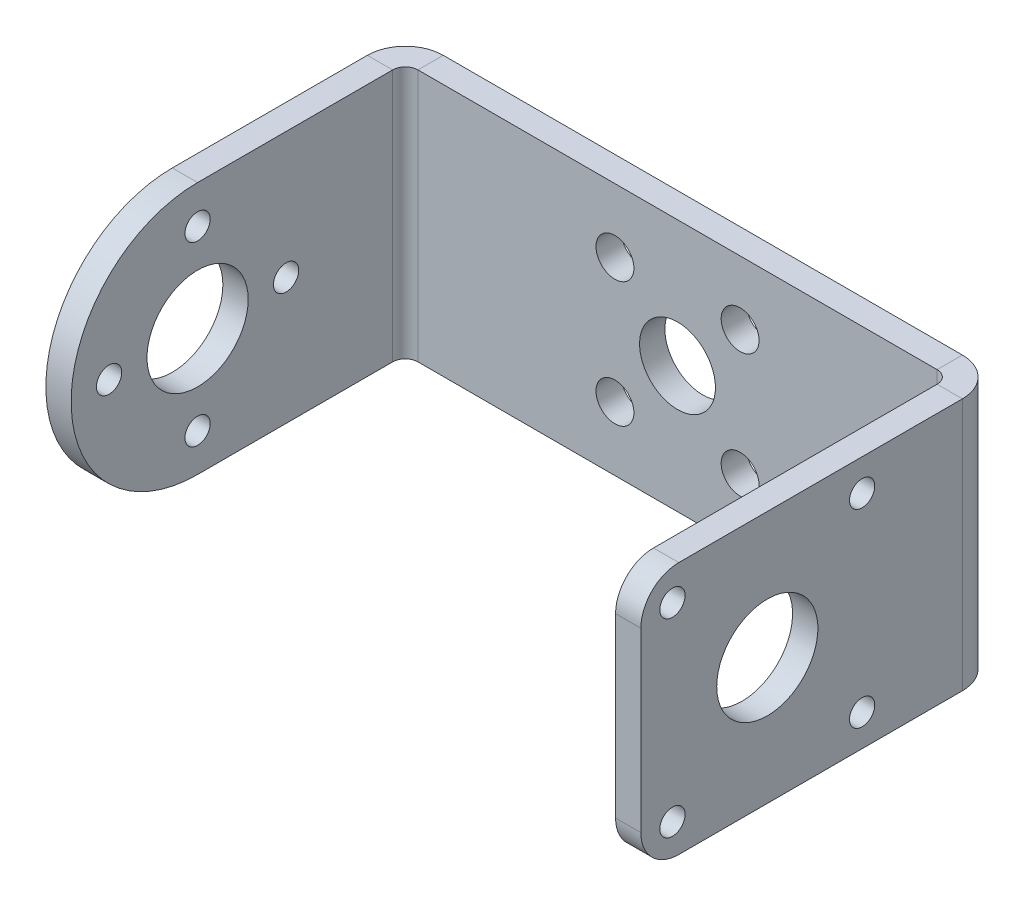
ISO-10303-21;
HEADER;
FILE_DESCRIPTION(('STEP AP214'),'2;1');
FILE_NAME('part.step','',(''),(''),'','','');
FILE_SCHEMA(('AUTOMOTIVE_DESIGN { 1 0 10303 214 1 1 1 1 }'));
ENDSEC;
DATA;
#1=APPLICATION_CONTEXT('core data for automotive mechanical design processes');
#2=APPLICATION_PROTOCOL_DEFINITION('international standard','automotive_design',2000,#1);
#3=PRODUCT_CONTEXT('',#1,'mechanical');
#4=PRODUCT('Part','Part','',(#3));
#5=PRODUCT_RELATED_PRODUCT_CATEGORY('part','',(#4));
#6=PRODUCT_DEFINITION_FORMATION('','',#4);
#7=PRODUCT_DEFINITION_CONTEXT('part definition',#1,'design');
#8=PRODUCT_DEFINITION('design','',#6,#7);
#9=PRODUCT_DEFINITION_SHAPE('','',#8);
#10=(LENGTH_UNIT() NAMED_UNIT(*) SI_UNIT(.MILLI.,.METRE.));
#11=(NAMED_UNIT(*) PLANE_ANGLE_UNIT() SI_UNIT($,.RADIAN.));
#12=(NAMED_UNIT(*) SI_UNIT($,.STERADIAN.) SOLID_ANGLE_UNIT());
#13=UNCERTAINTY_MEASURE_WITH_UNIT(LENGTH_MEASURE(1.E-05),#10,'distance_accuracy_value','');
#14=(GEOMETRIC_REPRESENTATION_CONTEXT(3) GLOBAL_UNCERTAINTY_ASSIGNED_CONTEXT((#13)) GLOBAL_UNIT_ASSIGNED_CONTEXT((#10,
#11,#12)) REPRESENTATION_CONTEXT('',''));
#15=CARTESIAN_POINT('',(0.,0.,0.));
#16=DIRECTION('',(0.,0.,1.));
#17=DIRECTION('',(1.,0.,0.));
#18=AXIS2_PLACEMENT_3D('',#15,#16,#17);
#19=CARTESIAN_POINT('',(10.,0.,-2.));
#20=DIRECTION('',(0.,1.,0.));
#21=DIRECTION('',(0.,0.,1.));
#22=AXIS2_PLACEMENT_3D('',#19,#20,#21);
#23=PLANE('',#22);
#24=DIRECTION('',(-1.,0.,0.));
#25=VECTOR('',#24,1.);
#26=CARTESIAN_POINT('',(10.,0.,0.));
#27=LINE('',#26,#25);
#28=CARTESIAN_POINT('',(69.6292036732051,0.,0.));
#29=VERTEX_POINT('',#28);
#30=CARTESIAN_POINT('',(28.5707963267949,0.,0.));
#31=VERTEX_POINT('',#30);
#32=EDGE_CURVE('E71',#29,#31,#27,.T.);
#33=ORIENTED_EDGE('',*,*,#32,.F.);
#34=DIRECTION('',(0.,0.,-1.));
#35=VECTOR('',#34,1.);
#36=CARTESIAN_POINT('',(69.6292036732051,0.,-2.));
#37=LINE('',#36,#35);
#38=CARTESIAN_POINT('',(69.6292036732051,0.,-2.));
#39=VERTEX_POINT('',#38);
#40=EDGE_CURVE('E315',#29,#39,#37,.T.);
#41=ORIENTED_EDGE('',*,*,#40,.T.);
#42=DIRECTION('',(-1.,0.,0.));
#43=VECTOR('',#42,1.);
#44=CARTESIAN_POINT('',(10.,0.,-2.));
#45=LINE('',#44,#43);
#46=CARTESIAN_POINT('',(28.5707963267949,0.,-2.));
#47=VERTEX_POINT('',#46);
#48=EDGE_CURVE('E50',#39,#47,#45,.T.);
#49=ORIENTED_EDGE('',*,*,#48,.T.);
#50=DIRECTION('',(0.,0.,-1.));
#51=VECTOR('',#50,1.);
#52=CARTESIAN_POINT('',(28.5707963267949,0.,-2.));
#53=LINE('',#52,#51);
#54=EDGE_CURVE('E310',#31,#47,#53,.T.);
#55=ORIENTED_EDGE('',*,*,#54,.F.);
#56=EDGE_LOOP('',(#33,#41,#49,#55));
#57=FACE_BOUND('',#56,.T.);
#58=ADVANCED_FACE('F46',(#57),#23,.T.);
#59=CARTESIAN_POINT('',(95.2,-20.,-2.));
#60=DIRECTION('',(0.,-1.,0.));
#61=DIRECTION('',(0.,0.,-1.));
#62=AXIS2_PLACEMENT_3D('',#59,#60,#61);
#63=PLANE('',#62);
#64=DIRECTION('',(1.,0.,0.));
#65=VECTOR('',#64,1.);
#66=CARTESIAN_POINT('',(95.2,-20.,-2.));
#67=LINE('',#66,#65);
#68=CARTESIAN_POINT('',(28.5707963267949,-20.,-2.));
#69=VERTEX_POINT('',#68);
#70=CARTESIAN_POINT('',(69.6292036732051,-20.,-2.));
#71=VERTEX_POINT('',#70);
#72=EDGE_CURVE('E319',#69,#71,#67,.T.);
#73=ORIENTED_EDGE('',*,*,#72,.T.);
#74=DIRECTION('',(0.,0.,1.));
#75=VECTOR('',#74,1.);
#76=CARTESIAN_POINT('',(69.6292036732051,-20.,-2.));
#77=LINE('',#76,#75);
#78=CARTESIAN_POINT('',(69.6292036732051,-20.,0.));
#79=VERTEX_POINT('',#78);
#80=EDGE_CURVE('E12',#71,#79,#77,.T.);
#81=ORIENTED_EDGE('',*,*,#80,.T.);
#82=DIRECTION('',(1.,0.,0.));
#83=VECTOR('',#82,1.);
#84=CARTESIAN_POINT('',(95.2,-20.,0.));
#85=LINE('',#84,#83);
#86=CARTESIAN_POINT('',(28.5707963267949,-20.,0.));
#87=VERTEX_POINT('',#86);
#88=EDGE_CURVE('E299',#87,#79,#85,.T.);
#89=ORIENTED_EDGE('',*,*,#88,.F.);
#90=DIRECTION('',(0.,0.,1.));
#91=VECTOR('',#90,1.);
#92=CARTESIAN_POINT('',(28.5707963267949,-20.,-2.));
#93=LINE('',#92,#91);
#94=EDGE_CURVE('E304',#69,#87,#93,.T.);
#95=ORIENTED_EDGE('',*,*,#94,.F.);
#96=EDGE_LOOP('',(#73,#81,#89,#95));
#97=FACE_BOUND('',#96,.T.);
#98=ADVANCED_FACE('F48',(#97),#63,.T.);
#99=CARTESIAN_POINT('',(10.,-10.,0.));
#100=DIRECTION('',(0.,0.,1.));
#101=DIRECTION('',(1.,0.,0.));
#102=AXIS2_PLACEMENT_3D('',#99,#100,#101);
#103=PLANE('',#102);
#104=CARTESIAN_POINT('',(49.1,-10.0000000000001,0.));
#105=DIRECTION('',(0.,0.,1.));
#106=DIRECTION('',(1.,0.,0.));
#107=AXIS2_PLACEMENT_3D('',#104,#105,#106);
#108=CIRCLE('',#107,3.);
#109=CARTESIAN_POINT('',(52.1,-10.0000000000001,0.));
#110=VERTEX_POINT('',#109);
#111=EDGE_CURVE('E293',#110,#110,#108,.T.);
#112=ORIENTED_EDGE('',*,*,#111,.F.);
#113=EDGE_LOOP('',(#112));
#114=FACE_BOUND('',#113,.T.);
#115=CARTESIAN_POINT('',(54.05,-5.05000000000008,0.));
#116=DIRECTION('',(0.,0.,1.));
#117=DIRECTION('',(1.,0.,0.));
#118=AXIS2_PLACEMENT_3D('',#115,#116,#117);
#119=CIRCLE('',#118,1.5);
#120=CARTESIAN_POINT('',(55.55,-5.05000000000008,0.));
#121=VERTEX_POINT('',#120);
#122=EDGE_CURVE('E287',#121,#121,#119,.T.);
#123=ORIENTED_EDGE('',*,*,#122,.F.);
#124=EDGE_LOOP('',(#123));
#125=FACE_BOUND('',#124,.T.);
#126=CARTESIAN_POINT('',(44.15,-5.05000000000015,0.));
#127=DIRECTION('',(0.,0.,1.));
#128=DIRECTION('',(1.,0.,0.));
#129=AXIS2_PLACEMENT_3D('',#126,#127,#128);
#130=CIRCLE('',#129,1.5);
#131=CARTESIAN_POINT('',(45.65,-5.05000000000015,0.));
#132=VERTEX_POINT('',#131);
#133=EDGE_CURVE('E281',#132,#132,#130,.T.);
#134=ORIENTED_EDGE('',*,*,#133,.F.);
#135=EDGE_LOOP('',(#134));
#136=FACE_BOUND('',#135,.T.);
#137=CARTESIAN_POINT('',(44.1500000000001,-14.9500000000002,0.));
#138=DIRECTION('',(0.,0.,1.));
#139=DIRECTION('',(1.,0.,0.));
#140=AXIS2_PLACEMENT_3D('',#137,#138,#139);
#141=CIRCLE('',#140,1.50000000000001);
#142=CARTESIAN_POINT('',(45.6500000000001,-14.9500000000002,0.));
#143=VERTEX_POINT('',#142);
#144=EDGE_CURVE('E275',#143,#143,#141,.T.);
#145=ORIENTED_EDGE('',*,*,#144,.F.);
#146=EDGE_LOOP('',(#145));
#147=FACE_BOUND('',#146,.T.);
#148=CARTESIAN_POINT('',(54.0500000000001,-14.9500000000001,0.));
#149=DIRECTION('',(0.,0.,1.));
#150=DIRECTION('',(1.,0.,0.));
#151=AXIS2_PLACEMENT_3D('',#148,#149,#150);
#152=CIRCLE('',#151,1.5);
#153=CARTESIAN_POINT('',(55.5500000000001,-14.9500000000001,0.));
#154=VERTEX_POINT('',#153);
#155=EDGE_CURVE('E267',#154,#154,#152,.T.);
#156=ORIENTED_EDGE('',*,*,#155,.F.);
#157=EDGE_LOOP('',(#156));
#158=FACE_BOUND('',#157,.T.);
#159=ORIENTED_EDGE('',*,*,#88,.T.);
#160=DIRECTION('',(0.,1.,0.));
#161=VECTOR('',#160,1.);
#162=CARTESIAN_POINT('',(69.6292036732051,-10.,0.));
#163=LINE('',#162,#161);
#164=EDGE_CURVE('E55',#79,#29,#163,.T.);
#165=ORIENTED_EDGE('',*,*,#164,.T.);
#166=ORIENTED_EDGE('',*,*,#32,.T.);
#167=DIRECTION('',(0.,1.,0.));
#168=VECTOR('',#167,1.);
#169=CARTESIAN_POINT('',(28.5707963267949,-10.,0.));
#170=LINE('',#169,#168);
#171=EDGE_CURVE('E307',#87,#31,#170,.T.);
#172=ORIENTED_EDGE('',*,*,#171,.F.);
#173=EDGE_LOOP('',(#159,#165,#166,#172));
#174=FACE_BOUND('',#173,.T.);
#175=ADVANCED_FACE('F323',(#114,#125,#136,#147,#158,#174),#103,.T.);
#176=CARTESIAN_POINT('',(10.,-10.,-2.));
#177=DIRECTION('',(0.,0.,1.));
#178=DIRECTION('',(1.,0.,0.));
#179=AXIS2_PLACEMENT_3D('',#176,#177,#178);
#180=PLANE('',#179);
#181=DIRECTION('',(0.,1.,0.));
#182=VECTOR('',#181,1.);
#183=CARTESIAN_POINT('',(69.6292036732051,-10.,-2.));
#184=LINE('',#183,#182);
#185=EDGE_CURVE('E313',#71,#39,#184,.T.);
#186=ORIENTED_EDGE('',*,*,#185,.F.);
#187=ORIENTED_EDGE('',*,*,#72,.F.);
#188=DIRECTION('',(0.,1.,0.));
#189=VECTOR('',#188,1.);
#190=CARTESIAN_POINT('',(28.5707963267949,-10.,-2.));
#191=LINE('',#190,#189);
#192=EDGE_CURVE('E302',#69,#47,#191,.T.);
#193=ORIENTED_EDGE('',*,*,#192,.T.);
#194=ORIENTED_EDGE('',*,*,#48,.F.);
#195=EDGE_LOOP('',(#186,#187,#193,#194));
#196=FACE_BOUND('',#195,.T.);
#197=CARTESIAN_POINT('',(49.1,-10.0000000000001,-2.));
#198=DIRECTION('',(0.,0.,1.));
#199=DIRECTION('',(1.,0.,0.));
#200=AXIS2_PLACEMENT_3D('',#197,#198,#199);
#201=CIRCLE('',#200,3.);
#202=CARTESIAN_POINT('',(52.1,-10.0000000000001,-2.));
#203=VERTEX_POINT('',#202);
#204=EDGE_CURVE('E296',#203,#203,#201,.T.);
#205=ORIENTED_EDGE('',*,*,#204,.T.);
#206=EDGE_LOOP('',(#205));
#207=FACE_BOUND('',#206,.T.);
#208=CARTESIAN_POINT('',(54.05,-5.05000000000008,-2.));
#209=DIRECTION('',(0.,0.,1.));
#210=DIRECTION('',(1.,0.,0.));
#211=AXIS2_PLACEMENT_3D('',#208,#209,#210);
#212=CIRCLE('',#211,1.5);
#213=CARTESIAN_POINT('',(55.55,-5.05000000000008,-2.));
#214=VERTEX_POINT('',#213);
#215=EDGE_CURVE('E290',#214,#214,#212,.T.);
#216=ORIENTED_EDGE('',*,*,#215,.T.);
#217=EDGE_LOOP('',(#216));
#218=FACE_BOUND('',#217,.T.);
#219=CARTESIAN_POINT('',(44.15,-5.05000000000015,-2.));
#220=DIRECTION('',(0.,0.,1.));
#221=DIRECTION('',(1.,0.,0.));
#222=AXIS2_PLACEMENT_3D('',#219,#220,#221);
#223=CIRCLE('',#222,1.5);
#224=CARTESIAN_POINT('',(45.65,-5.05000000000015,-2.));
#225=VERTEX_POINT('',#224);
#226=EDGE_CURVE('E284',#225,#225,#223,.T.);
#227=ORIENTED_EDGE('',*,*,#226,.T.);
#228=EDGE_LOOP('',(#227));
#229=FACE_BOUND('',#228,.T.);
#230=CARTESIAN_POINT('',(44.1500000000001,-14.9500000000002,-2.));
#231=DIRECTION('',(0.,0.,1.));
#232=DIRECTION('',(1.,0.,0.));
#233=AXIS2_PLACEMENT_3D('',#230,#231,#232);
#234=CIRCLE('',#233,1.50000000000001);
#235=CARTESIAN_POINT('',(45.6500000000001,-14.9500000000002,-2.));
#236=VERTEX_POINT('',#235);
#237=EDGE_CURVE('E278',#236,#236,#234,.T.);
#238=ORIENTED_EDGE('',*,*,#237,.T.);
#239=EDGE_LOOP('',(#238));
#240=FACE_BOUND('',#239,.T.);
#241=CARTESIAN_POINT('',(54.0500000000001,-14.9500000000001,-2.));
#242=DIRECTION('',(0.,0.,1.));
#243=DIRECTION('',(1.,0.,0.));
#244=AXIS2_PLACEMENT_3D('',#241,#242,#243);
#245=CIRCLE('',#244,1.5);
#246=CARTESIAN_POINT('',(55.5500000000001,-14.9500000000001,-2.));
#247=VERTEX_POINT('',#246);
#248=EDGE_CURVE('E272',#247,#247,#245,.T.);
#249=ORIENTED_EDGE('',*,*,#248,.T.);
#250=EDGE_LOOP('',(#249));
#251=FACE_BOUND('',#250,.T.);
#252=ADVANCED_FACE('F335',(#196,#207,#218,#229,#240,#251),#180,.F.);
#253=CARTESIAN_POINT('',(49.1,-10.0000000000001,-2.));
#254=DIRECTION('',(0.,0.,1.));
#255=DIRECTION('',(1.,0.,0.));
#256=AXIS2_PLACEMENT_3D('',#253,#254,#255);
#257=CYLINDRICAL_SURFACE('',#256,3.);
#258=ORIENTED_EDGE('',*,*,#204,.F.);
#259=EDGE_LOOP('',(#258));
#260=FACE_BOUND('',#259,.T.);
#261=ORIENTED_EDGE('',*,*,#111,.T.);
#262=EDGE_LOOP('',(#261));
#263=FACE_BOUND('',#262,.T.);
#264=ADVANCED_FACE('F433',(#260,#263),#257,.F.);
#265=CARTESIAN_POINT('',(54.05,-5.05000000000008,-2.));
#266=DIRECTION('',(0.,0.,1.));
#267=DIRECTION('',(1.,0.,0.));
#268=AXIS2_PLACEMENT_3D('',#265,#266,#267);
#269=CYLINDRICAL_SURFACE('',#268,1.5);
#270=ORIENTED_EDGE('',*,*,#215,.F.);
#271=EDGE_LOOP('',(#270));
#272=FACE_BOUND('',#271,.T.);
#273=ORIENTED_EDGE('',*,*,#122,.T.);
#274=EDGE_LOOP('',(#273));
#275=FACE_BOUND('',#274,.T.);
#276=ADVANCED_FACE('F465',(#272,#275),#269,.F.);
#277=CARTESIAN_POINT('',(44.15,-5.05000000000015,-2.));
#278=DIRECTION('',(0.,0.,1.));
#279=DIRECTION('',(1.,0.,0.));
#280=AXIS2_PLACEMENT_3D('',#277,#278,#279);
#281=CYLINDRICAL_SURFACE('',#280,1.5);
#282=ORIENTED_EDGE('',*,*,#226,.F.);
#283=EDGE_LOOP('',(#282));
#284=FACE_BOUND('',#283,.T.);
#285=ORIENTED_EDGE('',*,*,#133,.T.);
#286=EDGE_LOOP('',(#285));
#287=FACE_BOUND('',#286,.T.);
#288=ADVANCED_FACE('F457',(#284,#287),#281,.F.);
#289=CARTESIAN_POINT('',(44.1500000000001,-14.9500000000002,-2.));
#290=DIRECTION('',(0.,0.,1.));
#291=DIRECTION('',(1.,0.,0.));
#292=AXIS2_PLACEMENT_3D('',#289,#290,#291);
#293=CYLINDRICAL_SURFACE('',#292,1.50000000000001);
#294=ORIENTED_EDGE('',*,*,#237,.F.);
#295=EDGE_LOOP('',(#294));
#296=FACE_BOUND('',#295,.T.);
#297=ORIENTED_EDGE('',*,*,#144,.T.);
#298=EDGE_LOOP('',(#297));
#299=FACE_BOUND('',#298,.T.);
#300=ADVANCED_FACE('F447',(#296,#299),#293,.F.);
#301=CARTESIAN_POINT('',(54.0500000000001,-14.9500000000001,-2.));
#302=DIRECTION('',(0.,0.,1.));
#303=DIRECTION('',(1.,0.,0.));
#304=AXIS2_PLACEMENT_3D('',#301,#302,#303);
#305=CYLINDRICAL_SURFACE('',#304,1.5);
#306=ORIENTED_EDGE('',*,*,#248,.F.);
#307=EDGE_LOOP('',(#306));
#308=FACE_BOUND('',#307,.T.);
#309=ORIENTED_EDGE('',*,*,#155,.T.);
#310=EDGE_LOOP('',(#309));
#311=FACE_BOUND('',#310,.T.);
#312=ADVANCED_FACE('F444',(#308,#311),#305,.F.);
#313=CARTESIAN_POINT('',(28.5707963267949,-20.,1.));
#314=DIRECTION('',(0.,-1.,0.));
#315=DIRECTION('',(0.,0.,-1.));
#316=AXIS2_PLACEMENT_3D('',#313,#314,#315);
#317=PLANE('',#316);
#318=ORIENTED_EDGE('',*,*,#94,.T.);
#319=CARTESIAN_POINT('',(28.5707963267949,-20.,1.));
#320=DIRECTION('',(0.,1.,0.));
#321=DIRECTION('',(-1.,0.,0.));
#322=AXIS2_PLACEMENT_3D('',#319,#320,#321);
#323=CIRCLE('',#322,1.);
#324=CARTESIAN_POINT('',(27.5707963267949,-20.,1.));
#325=VERTEX_POINT('',#324);
#326=EDGE_CURVE('E202',#87,#325,#323,.T.);
#327=ORIENTED_EDGE('',*,*,#326,.T.);
#328=DIRECTION('',(1.,0.,0.));
#329=VECTOR('',#328,1.);
#330=CARTESIAN_POINT('',(25.5707963267949,-20.,1.00000000000001));
#331=LINE('',#330,#329);
#332=CARTESIAN_POINT('',(25.5707963267949,-20.,1.00000000000001));
#333=VERTEX_POINT('',#332);
#334=EDGE_CURVE('E217',#333,#325,#331,.T.);
#335=ORIENTED_EDGE('',*,*,#334,.F.);
#336=CARTESIAN_POINT('',(28.5707963267949,-20.,1.));
#337=DIRECTION('',(0.,1.,0.));
#338=DIRECTION('',(0.,0.,-1.));
#339=AXIS2_PLACEMENT_3D('',#336,#337,#338);
#340=CIRCLE('',#339,3.);
#341=EDGE_CURVE('E260',#69,#333,#340,.T.);
#342=ORIENTED_EDGE('',*,*,#341,.F.);
#343=EDGE_LOOP('',(#318,#327,#335,#342));
#344=FACE_BOUND('',#343,.T.);
#345=ADVANCED_FACE('F446',(#344),#317,.T.);
#346=CARTESIAN_POINT('',(28.5707963267949,0.,1.));
#347=DIRECTION('',(0.,1.,0.));
#348=DIRECTION('',(-1.,0.,0.));
#349=AXIS2_PLACEMENT_3D('',#346,#347,#348);
#350=PLANE('',#349);
#351=DIRECTION('',(-1.,0.,0.));
#352=VECTOR('',#351,1.);
#353=CARTESIAN_POINT('',(25.5707963267949,0.,1.00000000000001));
#354=LINE('',#353,#352);
#355=CARTESIAN_POINT('',(27.5707963267949,0.,1.));
#356=VERTEX_POINT('',#355);
#357=CARTESIAN_POINT('',(25.5707963267949,0.,1.00000000000001));
#358=VERTEX_POINT('',#357);
#359=EDGE_CURVE('E205',#356,#358,#354,.T.);
#360=ORIENTED_EDGE('',*,*,#359,.F.);
#361=CARTESIAN_POINT('',(28.5707963267949,0.,1.));
#362=DIRECTION('',(0.,1.,0.));
#363=DIRECTION('',(-1.,0.,0.));
#364=AXIS2_PLACEMENT_3D('',#361,#362,#363);
#365=CIRCLE('',#364,1.);
#366=EDGE_CURVE('E264',#356,#31,#365,.F.);
#367=ORIENTED_EDGE('',*,*,#366,.T.);
#368=ORIENTED_EDGE('',*,*,#54,.T.);
#369=CARTESIAN_POINT('',(28.5707963267949,0.,1.));
#370=DIRECTION('',(0.,-1.,0.));
#371=DIRECTION('',(-1.,0.,0.));
#372=AXIS2_PLACEMENT_3D('',#369,#370,#371);
#373=CIRCLE('',#372,3.);
#374=EDGE_CURVE('E263',#358,#47,#373,.T.);
#375=ORIENTED_EDGE('',*,*,#374,.F.);
#376=EDGE_LOOP('',(#360,#367,#368,#375));
#377=FACE_BOUND('',#376,.T.);
#378=ADVANCED_FACE('F454',(#377),#350,.T.);
#379=CARTESIAN_POINT('',(28.5707963267949,-30.343785399996,1.));
#380=DIRECTION('',(0.,1.,0.));
#381=DIRECTION('',(-1.,0.,0.));
#382=AXIS2_PLACEMENT_3D('',#379,#380,#381);
#383=CYLINDRICAL_SURFACE('',#382,3.);
#384=ORIENTED_EDGE('',*,*,#374,.T.);
#385=ORIENTED_EDGE('',*,*,#192,.F.);
#386=ORIENTED_EDGE('',*,*,#341,.T.);
#387=DIRECTION('',(0.,1.,0.));
#388=VECTOR('',#387,1.);
#389=CARTESIAN_POINT('',(25.5707963267949,-10.,1.00000000000001));
#390=LINE('',#389,#388);
#391=EDGE_CURVE('E195',#333,#358,#390,.T.);
#392=ORIENTED_EDGE('',*,*,#391,.T.);
#393=EDGE_LOOP('',(#384,#385,#386,#392));
#394=FACE_BOUND('',#393,.T.);
#395=ADVANCED_FACE('F544',(#394),#383,.T.);
#396=CARTESIAN_POINT('',(28.5707963267949,-30.343785399996,1.));
#397=DIRECTION('',(0.,1.,0.));
#398=DIRECTION('',(-1.,0.,0.));
#399=AXIS2_PLACEMENT_3D('',#396,#397,#398);
#400=CYLINDRICAL_SURFACE('',#399,1.);
#401=ORIENTED_EDGE('',*,*,#366,.F.);
#402=DIRECTION('',(0.,1.,0.));
#403=VECTOR('',#402,1.);
#404=CARTESIAN_POINT('',(27.5707963267949,-10.,1.));
#405=LINE('',#404,#403);
#406=EDGE_CURVE('E212',#325,#356,#405,.T.);
#407=ORIENTED_EDGE('',*,*,#406,.F.);
#408=ORIENTED_EDGE('',*,*,#326,.F.);
#409=ORIENTED_EDGE('',*,*,#171,.T.);
#410=EDGE_LOOP('',(#401,#407,#408,#409));
#411=FACE_BOUND('',#410,.T.);
#412=ADVANCED_FACE('F554',(#411),#400,.F.);
#413=CARTESIAN_POINT('',(25.570796326795,-10.,16.4292036732051));
#414=DIRECTION('',(1.,0.,0.));
#415=DIRECTION('',(0.,0.,-1.));
#416=AXIS2_PLACEMENT_3D('',#413,#414,#415);
#417=CYLINDRICAL_SURFACE('',#416,4.);
#418=CARTESIAN_POINT('',(25.570796326795,-10.,16.4292036732051));
#419=DIRECTION('',(1.,0.,0.));
#420=DIRECTION('',(0.,0.,-1.));
#421=AXIS2_PLACEMENT_3D('',#418,#419,#420);
#422=CIRCLE('',#421,4.);
#423=CARTESIAN_POINT('',(25.5707963267949,-10.,12.4292036732051));
#424=VERTEX_POINT('',#423);
#425=EDGE_CURVE('E223',#424,#424,#422,.T.);
#426=ORIENTED_EDGE('',*,*,#425,.F.);
#427=EDGE_LOOP('',(#426));
#428=FACE_BOUND('',#427,.T.);
#429=CARTESIAN_POINT('',(27.570796326795,-10.,16.4292036732051));
#430=DIRECTION('',(1.,0.,0.));
#431=DIRECTION('',(0.,0.,-1.));
#432=AXIS2_PLACEMENT_3D('',#429,#430,#431);
#433=CIRCLE('',#432,4.);
#434=CARTESIAN_POINT('',(27.5707963267949,-10.,12.4292036732051));
#435=VERTEX_POINT('',#434);
#436=EDGE_CURVE('E255',#435,#435,#433,.T.);
#437=ORIENTED_EDGE('',*,*,#436,.T.);
#438=EDGE_LOOP('',(#437));
#439=FACE_BOUND('',#438,.T.);
#440=ADVANCED_FACE('F565',(#428,#439),#417,.F.);
#441=CARTESIAN_POINT('',(25.570796326795,-17.,16.4292036732051));
#442=DIRECTION('',(1.,0.,0.));
#443=DIRECTION('',(0.,0.,-1.));
#444=AXIS2_PLACEMENT_3D('',#441,#442,#443);
#445=CYLINDRICAL_SURFACE('',#444,1.);
#446=CARTESIAN_POINT('',(25.570796326795,-17.,16.4292036732051));
#447=DIRECTION('',(1.,0.,0.));
#448=DIRECTION('',(0.,0.,-1.));
#449=AXIS2_PLACEMENT_3D('',#446,#447,#448);
#450=CIRCLE('',#449,1.);
#451=CARTESIAN_POINT('',(25.5707963267949,-17.,15.4292036732051));
#452=VERTEX_POINT('',#451);
#453=EDGE_CURVE('E226',#452,#452,#450,.T.);
#454=ORIENTED_EDGE('',*,*,#453,.F.);
#455=EDGE_LOOP('',(#454));
#456=FACE_BOUND('',#455,.T.);
#457=CARTESIAN_POINT('',(27.570796326795,-17.,16.4292036732051));
#458=DIRECTION('',(1.,0.,0.));
#459=DIRECTION('',(0.,0.,-1.));
#460=AXIS2_PLACEMENT_3D('',#457,#458,#459);
#461=CIRCLE('',#460,1.);
#462=CARTESIAN_POINT('',(27.5707963267949,-17.,15.4292036732051));
#463=VERTEX_POINT('',#462);
#464=EDGE_CURVE('E252',#463,#463,#461,.T.);
#465=ORIENTED_EDGE('',*,*,#464,.T.);
#466=EDGE_LOOP('',(#465));
#467=FACE_BOUND('',#466,.T.);
#468=ADVANCED_FACE('F576',(#456,#467),#445,.F.);
#469=CARTESIAN_POINT('',(25.570796326795,-9.99999999999998,23.4292036732051));
#470=DIRECTION('',(1.,0.,0.));
#471=DIRECTION('',(0.,0.,-1.));
#472=AXIS2_PLACEMENT_3D('',#469,#470,#471);
#473=CYLINDRICAL_SURFACE('',#472,1.);
#474=CARTESIAN_POINT('',(25.570796326795,-9.99999999999998,23.4292036732051));
#475=DIRECTION('',(1.,0.,0.));
#476=DIRECTION('',(0.,0.,-1.));
#477=AXIS2_PLACEMENT_3D('',#474,#475,#476);
#478=CIRCLE('',#477,1.);
#479=CARTESIAN_POINT('',(25.570796326795,-9.99999999999998,22.4292036732051));
#480=VERTEX_POINT('',#479);
#481=EDGE_CURVE('E229',#480,#480,#478,.T.);
#482=ORIENTED_EDGE('',*,*,#481,.F.);
#483=EDGE_LOOP('',(#482));
#484=FACE_BOUND('',#483,.T.);
#485=CARTESIAN_POINT('',(27.570796326795,-9.99999999999998,23.4292036732051));
#486=DIRECTION('',(1.,0.,0.));
#487=DIRECTION('',(0.,0.,-1.));
#488=AXIS2_PLACEMENT_3D('',#485,#486,#487);
#489=CIRCLE('',#488,1.);
#490=CARTESIAN_POINT('',(27.570796326795,-9.99999999999998,22.4292036732051));
#491=VERTEX_POINT('',#490);
#492=EDGE_CURVE('E249',#491,#491,#489,.T.);
#493=ORIENTED_EDGE('',*,*,#492,.T.);
#494=EDGE_LOOP('',(#493));
#495=FACE_BOUND('',#494,.T.);
#496=ADVANCED_FACE('F587',(#484,#495),#473,.F.);
#497=CARTESIAN_POINT('',(25.570796326795,-3.,16.4292036732051));
#498=DIRECTION('',(1.,0.,0.));
#499=DIRECTION('',(0.,0.,-1.));
#500=AXIS2_PLACEMENT_3D('',#497,#498,#499);
#501=CYLINDRICAL_SURFACE('',#500,1.);
#502=CARTESIAN_POINT('',(25.570796326795,-3.,16.4292036732051));
#503=DIRECTION('',(1.,0.,0.));
#504=DIRECTION('',(0.,0.,-1.));
#505=AXIS2_PLACEMENT_3D('',#502,#503,#504);
#506=CIRCLE('',#505,1.);
#507=CARTESIAN_POINT('',(25.5707963267949,-3.,15.4292036732051));
#508=VERTEX_POINT('',#507);
#509=EDGE_CURVE('E232',#508,#508,#506,.T.);
#510=ORIENTED_EDGE('',*,*,#509,.F.);
#511=EDGE_LOOP('',(#510));
#512=FACE_BOUND('',#511,.T.);
#513=CARTESIAN_POINT('',(27.570796326795,-3.,16.4292036732051));
#514=DIRECTION('',(1.,0.,0.));
#515=DIRECTION('',(0.,0.,-1.));
#516=AXIS2_PLACEMENT_3D('',#513,#514,#515);
#517=CIRCLE('',#516,1.);
#518=CARTESIAN_POINT('',(27.570796326795,-3.,15.4292036732051));
#519=VERTEX_POINT('',#518);
#520=EDGE_CURVE('E246',#519,#519,#517,.T.);
#521=ORIENTED_EDGE('',*,*,#520,.T.);
#522=EDGE_LOOP('',(#521));
#523=FACE_BOUND('',#522,.T.);
#524=ADVANCED_FACE('F598',(#512,#523),#501,.F.);
#525=CARTESIAN_POINT('',(25.5707963267949,-10.0000000000001,9.42920367320511));
#526=DIRECTION('',(1.,0.,0.));
#527=DIRECTION('',(0.,0.,-1.));
#528=AXIS2_PLACEMENT_3D('',#525,#526,#527);
#529=CYLINDRICAL_SURFACE('',#528,1.);
#530=CARTESIAN_POINT('',(25.5707963267949,-10.0000000000001,9.42920367320511));
#531=DIRECTION('',(1.,0.,0.));
#532=DIRECTION('',(0.,0.,-1.));
#533=AXIS2_PLACEMENT_3D('',#530,#531,#532);
#534=CIRCLE('',#533,1.);
#535=CARTESIAN_POINT('',(25.5707963267949,-10.0000000000001,8.4292036732051));
#536=VERTEX_POINT('',#535);
#537=EDGE_CURVE('E235',#536,#536,#534,.T.);
#538=ORIENTED_EDGE('',*,*,#537,.F.);
#539=EDGE_LOOP('',(#538));
#540=FACE_BOUND('',#539,.T.);
#541=CARTESIAN_POINT('',(27.5707963267949,-10.0000000000001,9.4292036732051));
#542=DIRECTION('',(1.,0.,0.));
#543=DIRECTION('',(0.,0.,-1.));
#544=AXIS2_PLACEMENT_3D('',#541,#542,#543);
#545=CIRCLE('',#544,1.);
#546=CARTESIAN_POINT('',(27.5707963267949,-10.0000000000001,8.4292036732051));
#547=VERTEX_POINT('',#546);
#548=EDGE_CURVE('E243',#547,#547,#545,.T.);
#549=ORIENTED_EDGE('',*,*,#548,.T.);
#550=EDGE_LOOP('',(#549));
#551=FACE_BOUND('',#550,.T.);
#552=ADVANCED_FACE('F609',(#540,#551),#529,.F.);
#553=CARTESIAN_POINT('',(25.570796326795,-10.,16.4292036732051));
#554=DIRECTION('',(1.,0.,0.));
#555=DIRECTION('',(0.,0.,-1.));
#556=AXIS2_PLACEMENT_3D('',#553,#554,#555);
#557=CYLINDRICAL_SURFACE('',#556,10.);
#558=CARTESIAN_POINT('',(27.570796326795,-10.,16.4292036732051));
#559=DIRECTION('',(1.,0.,0.));
#560=DIRECTION('',(0.,0.,-1.));
#561=AXIS2_PLACEMENT_3D('',#558,#559,#560);
#562=CIRCLE('',#561,10.);
#563=CARTESIAN_POINT('',(27.570796326795,0.,16.4292036732051));
#564=VERTEX_POINT('',#563);
#565=CARTESIAN_POINT('',(27.570796326795,-20.,16.4292036732051));
#566=VERTEX_POINT('',#565);
#567=EDGE_CURVE('E207',#564,#566,#562,.T.);
#568=ORIENTED_EDGE('',*,*,#567,.F.);
#569=DIRECTION('',(1.,0.,0.));
#570=VECTOR('',#569,1.);
#571=CARTESIAN_POINT('',(25.570796326795,0.,16.4292036732051));
#572=LINE('',#571,#570);
#573=CARTESIAN_POINT('',(25.570796326795,0.,16.4292036732051));
#574=VERTEX_POINT('',#573);
#575=EDGE_CURVE('E199',#574,#564,#572,.T.);
#576=ORIENTED_EDGE('',*,*,#575,.F.);
#577=CARTESIAN_POINT('',(25.570796326795,-10.,16.4292036732051));
#578=DIRECTION('',(1.,0.,0.));
#579=DIRECTION('',(0.,0.,-1.));
#580=AXIS2_PLACEMENT_3D('',#577,#578,#579);
#581=CIRCLE('',#580,10.);
#582=CARTESIAN_POINT('',(25.5707963267949,-20.,16.4292036732051));
#583=VERTEX_POINT('',#582);
#584=EDGE_CURVE('E240',#574,#583,#581,.T.);
#585=ORIENTED_EDGE('',*,*,#584,.T.);
#586=DIRECTION('',(1.,0.,0.));
#587=VECTOR('',#586,1.);
#588=CARTESIAN_POINT('',(25.5707963267949,-20.,16.4292036732051));
#589=LINE('',#588,#587);
#590=EDGE_CURVE('E238',#583,#566,#589,.T.);
#591=ORIENTED_EDGE('',*,*,#590,.T.);
#592=EDGE_LOOP('',(#568,#576,#585,#591));
#593=FACE_BOUND('',#592,.T.);
#594=ADVANCED_FACE('F620',(#593),#557,.T.);
#595=CARTESIAN_POINT('',(25.570796326795,-10.,16.4292036732051));
#596=DIRECTION('',(1.,0.,0.));
#597=DIRECTION('',(0.,0.,-1.));
#598=AXIS2_PLACEMENT_3D('',#595,#596,#597);
#599=PLANE('',#598);
#600=ORIENTED_EDGE('',*,*,#391,.F.);
#601=DIRECTION('',(0.,0.,-1.));
#602=VECTOR('',#601,1.);
#603=CARTESIAN_POINT('',(25.5707963267947,-20.,-68.7707963267949));
#604=LINE('',#603,#602);
#605=EDGE_CURVE('E220',#583,#333,#604,.T.);
#606=ORIENTED_EDGE('',*,*,#605,.F.);
#607=ORIENTED_EDGE('',*,*,#584,.F.);
#608=DIRECTION('',(0.,0.,1.));
#609=VECTOR('',#608,1.);
#610=CARTESIAN_POINT('',(25.570796326795,0.,16.4292036732051));
#611=LINE('',#610,#609);
#612=EDGE_CURVE('E203',#358,#574,#611,.T.);
#613=ORIENTED_EDGE('',*,*,#612,.F.);
#614=EDGE_LOOP('',(#600,#606,#607,#613));
#615=FACE_BOUND('',#614,.T.);
#616=ORIENTED_EDGE('',*,*,#537,.T.);
#617=EDGE_LOOP('',(#616));
#618=FACE_BOUND('',#617,.T.);
#619=ORIENTED_EDGE('',*,*,#509,.T.);
#620=EDGE_LOOP('',(#619));
#621=FACE_BOUND('',#620,.T.);
#622=ORIENTED_EDGE('',*,*,#481,.T.);
#623=EDGE_LOOP('',(#622));
#624=FACE_BOUND('',#623,.T.);
#625=ORIENTED_EDGE('',*,*,#453,.T.);
#626=EDGE_LOOP('',(#625));
#627=FACE_BOUND('',#626,.T.);
#628=ORIENTED_EDGE('',*,*,#425,.T.);
#629=EDGE_LOOP('',(#628));
#630=FACE_BOUND('',#629,.T.);
#631=ADVANCED_FACE('F631',(#615,#618,#621,#624,#627,#630),#599,.F.);
#632=CARTESIAN_POINT('',(25.5707963267947,-20.,-68.7707963267949));
#633=DIRECTION('',(0.,-1.,0.));
#634=DIRECTION('',(-1.,0.,0.));
#635=AXIS2_PLACEMENT_3D('',#632,#633,#634);
#636=PLANE('',#635);
#637=ORIENTED_EDGE('',*,*,#605,.T.);
#638=ORIENTED_EDGE('',*,*,#334,.T.);
#639=DIRECTION('',(0.,0.,-1.));
#640=VECTOR('',#639,1.);
#641=CARTESIAN_POINT('',(27.5707963267947,-20.,-68.7707963267949));
#642=LINE('',#641,#640);
#643=EDGE_CURVE('E215',#566,#325,#642,.T.);
#644=ORIENTED_EDGE('',*,*,#643,.F.);
#645=ORIENTED_EDGE('',*,*,#590,.F.);
#646=EDGE_LOOP('',(#637,#638,#644,#645));
#647=FACE_BOUND('',#646,.T.);
#648=ADVANCED_FACE('F642',(#647),#636,.T.);
#649=CARTESIAN_POINT('',(27.570796326795,-10.,16.4292036732051));
#650=DIRECTION('',(1.,0.,0.));
#651=DIRECTION('',(0.,0.,-1.));
#652=AXIS2_PLACEMENT_3D('',#649,#650,#651);
#653=PLANE('',#652);
#654=ORIENTED_EDGE('',*,*,#436,.F.);
#655=EDGE_LOOP('',(#654));
#656=FACE_BOUND('',#655,.T.);
#657=ORIENTED_EDGE('',*,*,#464,.F.);
#658=EDGE_LOOP('',(#657));
#659=FACE_BOUND('',#658,.T.);
#660=ORIENTED_EDGE('',*,*,#492,.F.);
#661=EDGE_LOOP('',(#660));
#662=FACE_BOUND('',#661,.T.);
#663=ORIENTED_EDGE('',*,*,#520,.F.);
#664=EDGE_LOOP('',(#663));
#665=FACE_BOUND('',#664,.T.);
#666=ORIENTED_EDGE('',*,*,#548,.F.);
#667=EDGE_LOOP('',(#666));
#668=FACE_BOUND('',#667,.T.);
#669=ORIENTED_EDGE('',*,*,#643,.T.);
#670=ORIENTED_EDGE('',*,*,#406,.T.);
#671=DIRECTION('',(0.,0.,1.));
#672=VECTOR('',#671,1.);
#673=CARTESIAN_POINT('',(27.570796326795,0.,16.4292036732051));
#674=LINE('',#673,#672);
#675=EDGE_CURVE('E210',#356,#564,#674,.T.);
#676=ORIENTED_EDGE('',*,*,#675,.T.);
#677=ORIENTED_EDGE('',*,*,#567,.T.);
#678=EDGE_LOOP('',(#669,#670,#676,#677));
#679=FACE_BOUND('',#678,.T.);
#680=ADVANCED_FACE('F653',(#656,#659,#662,#665,#668,#679),#653,.T.);
#681=CARTESIAN_POINT('',(25.570796326795,0.,16.4292036732051));
#682=DIRECTION('',(0.,1.,0.));
#683=DIRECTION('',(1.,0.,0.));
#684=AXIS2_PLACEMENT_3D('',#681,#682,#683);
#685=PLANE('',#684);
#686=ORIENTED_EDGE('',*,*,#675,.F.);
#687=ORIENTED_EDGE('',*,*,#359,.T.);
#688=ORIENTED_EDGE('',*,*,#612,.T.);
#689=ORIENTED_EDGE('',*,*,#575,.T.);
#690=EDGE_LOOP('',(#686,#687,#688,#689));
#691=FACE_BOUND('',#690,.T.);
#692=ADVANCED_FACE('F664',(#691),#685,.T.);
#693=CARTESIAN_POINT('',(69.6292036732051,-20.,1.));
#694=DIRECTION('',(0.,-1.,0.));
#695=DIRECTION('',(0.,0.,-1.));
#696=AXIS2_PLACEMENT_3D('',#693,#694,#695);
#697=PLANE('',#696);
#698=DIRECTION('',(-1.,0.,0.));
#699=VECTOR('',#698,1.);
#700=CARTESIAN_POINT('',(72.6292036732051,-20.,1.00000000000001));
#701=LINE('',#700,#699);
#702=CARTESIAN_POINT('',(72.6292036732051,-20.,1.00000000000001));
#703=VERTEX_POINT('',#702);
#704=CARTESIAN_POINT('',(70.6292036732051,-20.,1.00000000000001));
#705=VERTEX_POINT('',#704);
#706=EDGE_CURVE('E157',#703,#705,#701,.T.);
#707=ORIENTED_EDGE('',*,*,#706,.T.);
#708=CARTESIAN_POINT('',(69.6292036732051,-20.,1.));
#709=DIRECTION('',(0.,-1.,0.));
#710=DIRECTION('',(0.,0.,-1.));
#711=AXIS2_PLACEMENT_3D('',#708,#709,#710);
#712=CIRCLE('',#711,1.);
#713=EDGE_CURVE('E63',#705,#79,#712,.F.);
#714=ORIENTED_EDGE('',*,*,#713,.T.);
#715=ORIENTED_EDGE('',*,*,#80,.F.);
#716=CARTESIAN_POINT('',(69.6292036732051,-20.,1.));
#717=DIRECTION('',(0.,1.,0.));
#718=DIRECTION('',(0.,0.,-1.));
#719=AXIS2_PLACEMENT_3D('',#716,#717,#718);
#720=CIRCLE('',#719,3.);
#721=EDGE_CURVE('E188',#703,#71,#720,.T.);
#722=ORIENTED_EDGE('',*,*,#721,.F.);
#723=EDGE_LOOP('',(#707,#714,#715,#722));
#724=FACE_BOUND('',#723,.T.);
#725=ADVANCED_FACE('F326',(#724),#697,.T.);
#726=CARTESIAN_POINT('',(69.6292036732051,0.,1.));
#727=DIRECTION('',(0.,1.,0.));
#728=DIRECTION('',(0.,0.,1.));
#729=AXIS2_PLACEMENT_3D('',#726,#727,#728);
#730=PLANE('',#729);
#731=ORIENTED_EDGE('',*,*,#40,.F.);
#732=CARTESIAN_POINT('',(69.6292036732051,0.,1.));
#733=DIRECTION('',(0.,-1.,0.));
#734=DIRECTION('',(0.,0.,-1.));
#735=AXIS2_PLACEMENT_3D('',#732,#733,#734);
#736=CIRCLE('',#735,1.);
#737=CARTESIAN_POINT('',(70.6292036732051,0.,1.00000000000001));
#738=VERTEX_POINT('',#737);
#739=EDGE_CURVE('E192',#29,#738,#736,.T.);
#740=ORIENTED_EDGE('',*,*,#739,.T.);
#741=DIRECTION('',(1.,0.,0.));
#742=VECTOR('',#741,1.);
#743=CARTESIAN_POINT('',(72.6292036732051,0.,1.00000000000003));
#744=LINE('',#743,#742);
#745=CARTESIAN_POINT('',(72.6292036732051,0.,1.00000000000002));
#746=VERTEX_POINT('',#745);
#747=EDGE_CURVE('E177',#738,#746,#744,.T.);
#748=ORIENTED_EDGE('',*,*,#747,.T.);
#749=CARTESIAN_POINT('',(69.6292036732051,0.,1.));
#750=DIRECTION('',(0.,-1.,0.));
#751=DIRECTION('',(0.,0.,1.));
#752=AXIS2_PLACEMENT_3D('',#749,#750,#751);
#753=CIRCLE('',#752,3.);
#754=EDGE_CURVE('E191',#39,#746,#753,.T.);
#755=ORIENTED_EDGE('',*,*,#754,.F.);
#756=EDGE_LOOP('',(#731,#740,#748,#755));
#757=FACE_BOUND('',#756,.T.);
#758=ADVANCED_FACE('F342',(#757),#730,.T.);
#759=CARTESIAN_POINT('',(69.6292036732051,10.343785399996,1.));
#760=DIRECTION('',(0.,-1.,0.));
#761=DIRECTION('',(0.,0.,-1.));
#762=AXIS2_PLACEMENT_3D('',#759,#760,#761);
#763=CYLINDRICAL_SURFACE('',#762,3.);
#764=ORIENTED_EDGE('',*,*,#754,.T.);
#765=DIRECTION('',(0.,1.,0.));
#766=VECTOR('',#765,1.);
#767=CARTESIAN_POINT('',(72.6292036732051,-10.,1.00000000000003));
#768=LINE('',#767,#766);
#769=EDGE_CURVE('E332',#703,#746,#768,.T.);
#770=ORIENTED_EDGE('',*,*,#769,.F.);
#771=ORIENTED_EDGE('',*,*,#721,.T.);
#772=ORIENTED_EDGE('',*,*,#185,.T.);
#773=EDGE_LOOP('',(#764,#770,#771,#772));
#774=FACE_BOUND('',#773,.T.);
#775=ADVANCED_FACE('F330',(#774),#763,.T.);
#776=CARTESIAN_POINT('',(69.6292036732051,10.343785399996,1.));
#777=DIRECTION('',(0.,-1.,0.));
#778=DIRECTION('',(0.,0.,-1.));
#779=AXIS2_PLACEMENT_3D('',#776,#777,#778);
#780=CYLINDRICAL_SURFACE('',#779,1.);
#781=ORIENTED_EDGE('',*,*,#739,.F.);
#782=ORIENTED_EDGE('',*,*,#164,.F.);
#783=ORIENTED_EDGE('',*,*,#713,.F.);
#784=DIRECTION('',(0.,1.,0.));
#785=VECTOR('',#784,1.);
#786=CARTESIAN_POINT('',(70.6292036732051,-10.,1.00000000000001));
#787=LINE('',#786,#785);
#788=EDGE_CURVE('E181',#705,#738,#787,.T.);
#789=ORIENTED_EDGE('',*,*,#788,.T.);
#790=EDGE_LOOP('',(#781,#782,#783,#789));
#791=FACE_BOUND('',#790,.T.);
#792=ADVANCED_FACE('F344',(#791),#780,.F.);
#793=CARTESIAN_POINT('',(72.629203673205,-17.,23.4292036732051));
#794=DIRECTION('',(-1.,0.,0.));
#795=DIRECTION('',(0.,0.,1.));
#796=AXIS2_PLACEMENT_3D('',#793,#794,#795);
#797=CYLINDRICAL_SURFACE('',#796,3.);
#798=CARTESIAN_POINT('',(70.629203673205,-17.,23.4292036732051));
#799=DIRECTION('',(-1.,0.,0.));
#800=DIRECTION('',(0.,0.,-1.));
#801=AXIS2_PLACEMENT_3D('',#798,#799,#800);
#802=CIRCLE('',#801,3.);
#803=CARTESIAN_POINT('',(70.629203673205,-20.,23.4292036732051));
#804=VERTEX_POINT('',#803);
#805=CARTESIAN_POINT('',(70.629203673205,-17.,26.4292036732051));
#806=VERTEX_POINT('',#805);
#807=EDGE_CURVE('E169',#804,#806,#802,.T.);
#808=ORIENTED_EDGE('',*,*,#807,.F.);
#809=DIRECTION('',(-1.,0.,0.));
#810=VECTOR('',#809,1.);
#811=CARTESIAN_POINT('',(72.629203673205,-20.,23.4292036732051));
#812=LINE('',#811,#810);
#813=CARTESIAN_POINT('',(72.629203673205,-20.,23.4292036732051));
#814=VERTEX_POINT('',#813);
#815=EDGE_CURVE('E155',#814,#804,#812,.T.);
#816=ORIENTED_EDGE('',*,*,#815,.F.);
#817=CARTESIAN_POINT('',(72.629203673205,-17.,23.4292036732051));
#818=DIRECTION('',(-1.,0.,0.));
#819=DIRECTION('',(0.,0.,-1.));
#820=AXIS2_PLACEMENT_3D('',#817,#818,#819);
#821=CIRCLE('',#820,3.);
#822=CARTESIAN_POINT('',(72.629203673205,-17.,26.4292036732051));
#823=VERTEX_POINT('',#822);
#824=EDGE_CURVE('E167',#814,#823,#821,.T.);
#825=ORIENTED_EDGE('',*,*,#824,.T.);
#826=DIRECTION('',(-1.,0.,0.));
#827=VECTOR('',#826,1.);
#828=CARTESIAN_POINT('',(72.629203673205,-17.,26.4292036732051));
#829=LINE('',#828,#827);
#830=EDGE_CURVE('E176',#823,#806,#829,.T.);
#831=ORIENTED_EDGE('',*,*,#830,.T.);
#832=EDGE_LOOP('',(#808,#816,#825,#831));
#833=FACE_BOUND('',#832,.T.);
#834=ADVANCED_FACE('F166',(#833),#797,.T.);
#835=CARTESIAN_POINT('',(72.629203673205,-3.00000000000002,26.4292036732051));
#836=DIRECTION('',(0.,0.,1.));
#837=DIRECTION('',(1.,0.,0.));
#838=AXIS2_PLACEMENT_3D('',#835,#836,#837);
#839=PLANE('',#838);
#840=DIRECTION('',(0.,1.,0.));
#841=VECTOR('',#840,1.);
#842=CARTESIAN_POINT('',(70.629203673205,-3.00000000000002,26.4292036732051));
#843=LINE('',#842,#841);
#844=CARTESIAN_POINT('',(70.629203673205,-3.00000000000002,26.4292036732051));
#845=VERTEX_POINT('',#844);
#846=EDGE_CURVE('E404',#806,#845,#843,.T.);
#847=ORIENTED_EDGE('',*,*,#846,.F.);
#848=ORIENTED_EDGE('',*,*,#830,.F.);
#849=DIRECTION('',(0.,1.,0.));
#850=VECTOR('',#849,1.);
#851=CARTESIAN_POINT('',(72.629203673205,-3.00000000000002,26.4292036732051));
#852=LINE('',#851,#850);
#853=CARTESIAN_POINT('',(72.629203673205,-3.00000000000002,26.4292036732051));
#854=VERTEX_POINT('',#853);
#855=EDGE_CURVE('E175',#823,#854,#852,.T.);
#856=ORIENTED_EDGE('',*,*,#855,.T.);
#857=DIRECTION('',(-1.,0.,0.));
#858=VECTOR('',#857,1.);
#859=CARTESIAN_POINT('',(72.629203673205,-3.00000000000002,26.4292036732051));
#860=LINE('',#859,#858);
#861=EDGE_CURVE('E400',#854,#845,#860,.T.);
#862=ORIENTED_EDGE('',*,*,#861,.T.);
#863=EDGE_LOOP('',(#847,#848,#856,#862));
#864=FACE_BOUND('',#863,.T.);
#865=ADVANCED_FACE('F403',(#864),#839,.T.);
#866=CARTESIAN_POINT('',(72.629203673205,-3.,23.4292036732051));
#867=DIRECTION('',(-1.,0.,0.));
#868=DIRECTION('',(0.,0.,1.));
#869=AXIS2_PLACEMENT_3D('',#866,#867,#868);
#870=CYLINDRICAL_SURFACE('',#869,3.);
#871=CARTESIAN_POINT('',(70.629203673205,-3.,23.4292036732051));
#872=DIRECTION('',(-1.,0.,0.));
#873=DIRECTION('',(0.,0.,-1.));
#874=AXIS2_PLACEMENT_3D('',#871,#872,#873);
#875=CIRCLE('',#874,3.);
#876=CARTESIAN_POINT('',(70.629203673205,0.,23.4292036732051));
#877=VERTEX_POINT('',#876);
#878=EDGE_CURVE('E355',#845,#877,#875,.T.);
#879=ORIENTED_EDGE('',*,*,#878,.F.);
#880=ORIENTED_EDGE('',*,*,#861,.F.);
#881=CARTESIAN_POINT('',(72.629203673205,-3.,23.4292036732051));
#882=DIRECTION('',(-1.,0.,0.));
#883=DIRECTION('',(0.,0.,-1.));
#884=AXIS2_PLACEMENT_3D('',#881,#882,#883);
#885=CIRCLE('',#884,3.);
#886=CARTESIAN_POINT('',(72.629203673205,0.,23.4292036732051));
#887=VERTEX_POINT('',#886);
#888=EDGE_CURVE('E398',#854,#887,#885,.T.);
#889=ORIENTED_EDGE('',*,*,#888,.T.);
#890=DIRECTION('',(-1.,0.,0.));
#891=VECTOR('',#890,1.);
#892=CARTESIAN_POINT('',(72.629203673205,0.,23.4292036732051));
#893=LINE('',#892,#891);
#894=EDGE_CURVE('E361',#887,#877,#893,.T.);
#895=ORIENTED_EDGE('',*,*,#894,.T.);
#896=EDGE_LOOP('',(#879,#880,#889,#895));
#897=FACE_BOUND('',#896,.T.);
#898=ADVANCED_FACE('F409',(#897),#870,.T.);
#899=CARTESIAN_POINT('',(72.6292036732051,-10.,16.4292036732051));
#900=DIRECTION('',(-1.,0.,0.));
#901=DIRECTION('',(0.,0.,1.));
#902=AXIS2_PLACEMENT_3D('',#899,#900,#901);
#903=CYLINDRICAL_SURFACE('',#902,4.00000000000001);
#904=CARTESIAN_POINT('',(72.6292036732051,-10.,16.4292036732051));
#905=DIRECTION('',(-1.,0.,0.));
#906=DIRECTION('',(0.,0.,1.));
#907=AXIS2_PLACEMENT_3D('',#904,#905,#906);
#908=CIRCLE('',#907,4.00000000000001);
#909=CARTESIAN_POINT('',(72.629203673205,-10.,20.4292036732051));
#910=VERTEX_POINT('',#909);
#911=EDGE_CURVE('E364',#910,#910,#908,.T.);
#912=ORIENTED_EDGE('',*,*,#911,.F.);
#913=EDGE_LOOP('',(#912));
#914=FACE_BOUND('',#913,.T.);
#915=CARTESIAN_POINT('',(70.6292036732051,-10.,16.4292036732051));
#916=DIRECTION('',(-1.,0.,0.));
#917=DIRECTION('',(0.,0.,1.));
#918=AXIS2_PLACEMENT_3D('',#915,#916,#917);
#919=CIRCLE('',#918,4.00000000000001);
#920=CARTESIAN_POINT('',(70.629203673205,-10.,20.4292036732051));
#921=VERTEX_POINT('',#920);
#922=EDGE_CURVE('E394',#921,#921,#919,.T.);
#923=ORIENTED_EDGE('',*,*,#922,.T.);
#924=EDGE_LOOP('',(#923));
#925=FACE_BOUND('',#924,.T.);
#926=ADVANCED_FACE('F411',(#914,#925),#903,.F.);
#927=CARTESIAN_POINT('',(72.6292036732051,-2.5,8.9292036732051));
#928=DIRECTION('',(-1.,0.,0.));
#929=DIRECTION('',(0.,0.,1.));
#930=AXIS2_PLACEMENT_3D('',#927,#928,#929);
#931=CYLINDRICAL_SURFACE('',#930,0.999999999999998);
#932=CARTESIAN_POINT('',(72.6292036732051,-2.5,8.9292036732051));
#933=DIRECTION('',(-1.,0.,0.));
#934=DIRECTION('',(0.,0.,1.));
#935=AXIS2_PLACEMENT_3D('',#932,#933,#934);
#936=CIRCLE('',#935,0.999999999999998);
#937=CARTESIAN_POINT('',(72.6292036732051,-2.5,9.9292036732051));
#938=VERTEX_POINT('',#937);
#939=EDGE_CURVE('E367',#938,#938,#936,.T.);
#940=ORIENTED_EDGE('',*,*,#939,.F.);
#941=EDGE_LOOP('',(#940));
#942=FACE_BOUND('',#941,.T.);
#943=CARTESIAN_POINT('',(70.6292036732051,-2.5,8.92920367320509));
#944=DIRECTION('',(-1.,0.,0.));
#945=DIRECTION('',(0.,0.,1.));
#946=AXIS2_PLACEMENT_3D('',#943,#944,#945);
#947=CIRCLE('',#946,0.999999999999998);
#948=CARTESIAN_POINT('',(70.6292036732051,-2.5,9.92920367320508));
#949=VERTEX_POINT('',#948);
#950=EDGE_CURVE('E391',#949,#949,#947,.T.);
#951=ORIENTED_EDGE('',*,*,#950,.T.);
#952=EDGE_LOOP('',(#951));
#953=FACE_BOUND('',#952,.T.);
#954=ADVANCED_FACE('F417',(#942,#953),#931,.F.);
#955=CARTESIAN_POINT('',(72.629203673205,-2.5,23.9292036732051));
#956=DIRECTION('',(-1.,0.,0.));
#957=DIRECTION('',(0.,0.,1.));
#958=AXIS2_PLACEMENT_3D('',#955,#956,#957);
#959=CYLINDRICAL_SURFACE('',#958,0.999999999999998);
#960=CARTESIAN_POINT('',(72.629203673205,-2.5,23.9292036732051));
#961=DIRECTION('',(-1.,0.,0.));
#962=DIRECTION('',(0.,0.,1.));
#963=AXIS2_PLACEMENT_3D('',#960,#961,#962);
#964=CIRCLE('',#963,0.999999999999998);
#965=CARTESIAN_POINT('',(72.629203673205,-2.5,24.9292036732051));
#966=VERTEX_POINT('',#965);
#967=EDGE_CURVE('E373',#966,#966,#964,.T.);
#968=ORIENTED_EDGE('',*,*,#967,.F.);
#969=EDGE_LOOP('',(#968));
#970=FACE_BOUND('',#969,.T.);
#971=CARTESIAN_POINT('',(70.629203673205,-2.5,23.9292036732051));
#972=DIRECTION('',(-1.,0.,0.));
#973=DIRECTION('',(0.,0.,1.));
#974=AXIS2_PLACEMENT_3D('',#971,#972,#973);
#975=CIRCLE('',#974,0.999999999999998);
#976=CARTESIAN_POINT('',(70.629203673205,-2.5,24.9292036732051));
#977=VERTEX_POINT('',#976);
#978=EDGE_CURVE('E388',#977,#977,#975,.T.);
#979=ORIENTED_EDGE('',*,*,#978,.T.);
#980=EDGE_LOOP('',(#979));
#981=FACE_BOUND('',#980,.T.);
#982=ADVANCED_FACE('F748',(#970,#981),#959,.F.);
#983=CARTESIAN_POINT('',(72.629203673205,-17.5,23.9292036732053));
#984=DIRECTION('',(-1.,0.,0.));
#985=DIRECTION('',(0.,0.,1.));
#986=AXIS2_PLACEMENT_3D('',#983,#984,#985);
#987=CYLINDRICAL_SURFACE('',#986,0.999999999999998);
#988=CARTESIAN_POINT('',(72.629203673205,-17.5,23.9292036732053));
#989=DIRECTION('',(-1.,0.,0.));
#990=DIRECTION('',(0.,0.,1.));
#991=AXIS2_PLACEMENT_3D('',#988,#989,#990);
#992=CIRCLE('',#991,0.999999999999998);
#993=CARTESIAN_POINT('',(72.629203673205,-17.5,24.9292036732052));
#994=VERTEX_POINT('',#993);
#995=EDGE_CURVE('E376',#994,#994,#992,.T.);
#996=ORIENTED_EDGE('',*,*,#995,.F.);
#997=EDGE_LOOP('',(#996));
#998=FACE_BOUND('',#997,.T.);
#999=CARTESIAN_POINT('',(70.629203673205,-17.5,23.9292036732052));
#1000=DIRECTION('',(-1.,0.,0.));
#1001=DIRECTION('',(0.,0.,1.));
#1002=AXIS2_PLACEMENT_3D('',#999,#1000,#1001);
#1003=CIRCLE('',#1002,0.999999999999998);
#1004=CARTESIAN_POINT('',(70.629203673205,-17.5,24.9292036732052));
#1005=VERTEX_POINT('',#1004);
#1006=EDGE_CURVE('E385',#1005,#1005,#1003,.T.);
#1007=ORIENTED_EDGE('',*,*,#1006,.T.);
#1008=EDGE_LOOP('',(#1007));
#1009=FACE_BOUND('',#1008,.T.);
#1010=ADVANCED_FACE('F759',(#998,#1009),#987,.F.);
#1011=CARTESIAN_POINT('',(72.6292036732051,-17.5,8.92920367320525));
#1012=DIRECTION('',(-1.,0.,0.));
#1013=DIRECTION('',(0.,0.,1.));
#1014=AXIS2_PLACEMENT_3D('',#1011,#1012,#1013);
#1015=CYLINDRICAL_SURFACE('',#1014,0.999999999999998);
#1016=CARTESIAN_POINT('',(72.6292036732051,-17.5,8.92920367320525));
#1017=DIRECTION('',(-1.,0.,0.));
#1018=DIRECTION('',(0.,0.,1.));
#1019=AXIS2_PLACEMENT_3D('',#1016,#1017,#1018);
#1020=CIRCLE('',#1019,0.999999999999998);
#1021=CARTESIAN_POINT('',(72.6292036732051,-17.5,9.92920367320525));
#1022=VERTEX_POINT('',#1021);
#1023=EDGE_CURVE('E379',#1022,#1022,#1020,.T.);
#1024=ORIENTED_EDGE('',*,*,#1023,.F.);
#1025=EDGE_LOOP('',(#1024));
#1026=FACE_BOUND('',#1025,.T.);
#1027=CARTESIAN_POINT('',(70.6292036732051,-17.5,8.92920367320524));
#1028=DIRECTION('',(-1.,0.,0.));
#1029=DIRECTION('',(0.,0.,1.));
#1030=AXIS2_PLACEMENT_3D('',#1027,#1028,#1029);
#1031=CIRCLE('',#1030,0.999999999999998);
#1032=CARTESIAN_POINT('',(70.6292036732051,-17.5,9.92920367320523));
#1033=VERTEX_POINT('',#1032);
#1034=EDGE_CURVE('E382',#1033,#1033,#1031,.T.);
#1035=ORIENTED_EDGE('',*,*,#1034,.T.);
#1036=EDGE_LOOP('',(#1035));
#1037=FACE_BOUND('',#1036,.T.);
#1038=ADVANCED_FACE('F770',(#1026,#1037),#1015,.F.);
#1039=CARTESIAN_POINT('',(72.6292036732053,-10.,-61.7707963267949));
#1040=DIRECTION('',(-1.,0.,0.));
#1041=DIRECTION('',(0.,0.,1.));
#1042=AXIS2_PLACEMENT_3D('',#1039,#1040,#1041);
#1043=PLANE('',#1042);
#1044=ORIENTED_EDGE('',*,*,#1023,.T.);
#1045=EDGE_LOOP('',(#1044));
#1046=FACE_BOUND('',#1045,.T.);
#1047=ORIENTED_EDGE('',*,*,#995,.T.);
#1048=EDGE_LOOP('',(#1047));
#1049=FACE_BOUND('',#1048,.T.);
#1050=ORIENTED_EDGE('',*,*,#967,.T.);
#1051=EDGE_LOOP('',(#1050));
#1052=FACE_BOUND('',#1051,.T.);
#1053=ORIENTED_EDGE('',*,*,#939,.T.);
#1054=EDGE_LOOP('',(#1053));
#1055=FACE_BOUND('',#1054,.T.);
#1056=ORIENTED_EDGE('',*,*,#911,.T.);
#1057=EDGE_LOOP('',(#1056));
#1058=FACE_BOUND('',#1057,.T.);
#1059=DIRECTION('',(0.,0.,1.));
#1060=VECTOR('',#1059,1.);
#1061=CARTESIAN_POINT('',(72.629203673205,-20.,23.4292036732051));
#1062=LINE('',#1061,#1060);
#1063=EDGE_CURVE('E152',#703,#814,#1062,.T.);
#1064=ORIENTED_EDGE('',*,*,#1063,.F.);
#1065=ORIENTED_EDGE('',*,*,#769,.T.);
#1066=DIRECTION('',(0.,0.,-1.));
#1067=VECTOR('',#1066,1.);
#1068=CARTESIAN_POINT('',(72.6292036732053,0.,-61.7707963267949));
#1069=LINE('',#1068,#1067);
#1070=EDGE_CURVE('E360',#887,#746,#1069,.T.);
#1071=ORIENTED_EDGE('',*,*,#1070,.F.);
#1072=ORIENTED_EDGE('',*,*,#888,.F.);
#1073=ORIENTED_EDGE('',*,*,#855,.F.);
#1074=ORIENTED_EDGE('',*,*,#824,.F.);
#1075=EDGE_LOOP('',(#1064,#1065,#1071,#1072,#1073,#1074));
#1076=FACE_BOUND('',#1075,.T.);
#1077=ADVANCED_FACE('F172',(#1046,#1049,#1052,#1055,#1058,#1076),#1043,.F.);
#1078=CARTESIAN_POINT('',(72.6292036732053,0.,-61.7707963267949));
#1079=DIRECTION('',(0.,1.,0.));
#1080=DIRECTION('',(-1.,0.,0.));
#1081=AXIS2_PLACEMENT_3D('',#1078,#1079,#1080);
#1082=PLANE('',#1081);
#1083=ORIENTED_EDGE('',*,*,#747,.F.);
#1084=DIRECTION('',(0.,0.,-1.));
#1085=VECTOR('',#1084,1.);
#1086=CARTESIAN_POINT('',(70.6292036732053,0.,-61.7707963267949));
#1087=LINE('',#1086,#1085);
#1088=EDGE_CURVE('E162',#877,#738,#1087,.T.);
#1089=ORIENTED_EDGE('',*,*,#1088,.F.);
#1090=ORIENTED_EDGE('',*,*,#894,.F.);
#1091=ORIENTED_EDGE('',*,*,#1070,.T.);
#1092=EDGE_LOOP('',(#1083,#1089,#1090,#1091));
#1093=FACE_BOUND('',#1092,.T.);
#1094=ADVANCED_FACE('F358',(#1093),#1082,.T.);
#1095=CARTESIAN_POINT('',(70.6292036732053,-10.,-61.7707963267949));
#1096=DIRECTION('',(-1.,0.,0.));
#1097=DIRECTION('',(0.,0.,1.));
#1098=AXIS2_PLACEMENT_3D('',#1095,#1096,#1097);
#1099=PLANE('',#1098);
#1100=ORIENTED_EDGE('',*,*,#788,.F.);
#1101=DIRECTION('',(0.,0.,1.));
#1102=VECTOR('',#1101,1.);
#1103=CARTESIAN_POINT('',(70.629203673205,-20.,23.4292036732051));
#1104=LINE('',#1103,#1102);
#1105=EDGE_CURVE('E349',#705,#804,#1104,.T.);
#1106=ORIENTED_EDGE('',*,*,#1105,.T.);
#1107=ORIENTED_EDGE('',*,*,#807,.T.);
#1108=ORIENTED_EDGE('',*,*,#846,.T.);
#1109=ORIENTED_EDGE('',*,*,#878,.T.);
#1110=ORIENTED_EDGE('',*,*,#1088,.T.);
#1111=EDGE_LOOP('',(#1100,#1106,#1107,#1108,#1109,#1110));
#1112=FACE_BOUND('',#1111,.T.);
#1113=ORIENTED_EDGE('',*,*,#1034,.F.);
#1114=EDGE_LOOP('',(#1113));
#1115=FACE_BOUND('',#1114,.T.);
#1116=ORIENTED_EDGE('',*,*,#1006,.F.);
#1117=EDGE_LOOP('',(#1116));
#1118=FACE_BOUND('',#1117,.T.);
#1119=ORIENTED_EDGE('',*,*,#978,.F.);
#1120=EDGE_LOOP('',(#1119));
#1121=FACE_BOUND('',#1120,.T.);
#1122=ORIENTED_EDGE('',*,*,#950,.F.);
#1123=EDGE_LOOP('',(#1122));
#1124=FACE_BOUND('',#1123,.T.);
#1125=ORIENTED_EDGE('',*,*,#922,.F.);
#1126=EDGE_LOOP('',(#1125));
#1127=FACE_BOUND('',#1126,.T.);
#1128=ADVANCED_FACE('F347',(#1112,#1115,#1118,#1121,#1124,#1127),#1099,.T.);
#1129=CARTESIAN_POINT('',(72.629203673205,-20.,23.4292036732051));
#1130=DIRECTION('',(0.,-1.,0.));
#1131=DIRECTION('',(1.,0.,0.));
#1132=AXIS2_PLACEMENT_3D('',#1129,#1130,#1131);
#1133=PLANE('',#1132);
#1134=ORIENTED_EDGE('',*,*,#706,.F.);
#1135=ORIENTED_EDGE('',*,*,#1063,.T.);
#1136=ORIENTED_EDGE('',*,*,#815,.T.);
#1137=ORIENTED_EDGE('',*,*,#1105,.F.);
#1138=EDGE_LOOP('',(#1134,#1135,#1136,#1137));
#1139=FACE_BOUND('',#1138,.T.);
#1140=ADVANCED_FACE('F154',(#1139),#1133,.T.);
#1141=CLOSED_SHELL('',(#58,#98,#175,#252,#264,#276,#288,#300,#312,#345,#378,#395,#412,#440,#468,
#496,#524,#552,#594,#631,#648,#680,#692,#725,#758,#775,#792,#834,#865,#898,#926,#954,#982,#1010,
#1038,#1077,#1094,#1128,#1140));
#1142=MANIFOLD_SOLID_BREP('B2',#1141);
#1143=ADVANCED_BREP_SHAPE_REPRESENTATION('',(#18,#1142),#14);
#1144=SHAPE_DEFINITION_REPRESENTATION(#9,#1143);
ENDSEC;
END-ISO-10303-21;
